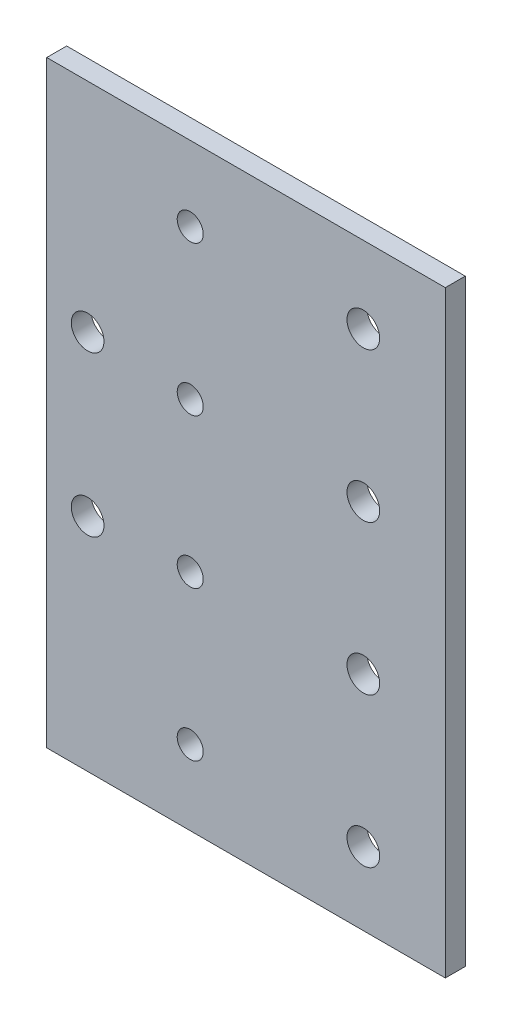
ISO-10303-21;
HEADER;
FILE_DESCRIPTION(('STEP AP214'),'2;1');
FILE_NAME('part.step','',(''),(''),'','','');
FILE_SCHEMA(('AUTOMOTIVE_DESIGN { 1 0 10303 214 1 1 1 1 }'));
ENDSEC;
DATA;
#1=APPLICATION_CONTEXT('core data for automotive mechanical design processes');
#2=APPLICATION_PROTOCOL_DEFINITION('international standard','automotive_design',2000,#1);
#3=PRODUCT_CONTEXT('',#1,'mechanical');
#4=PRODUCT('Part','Part','',(#3));
#5=PRODUCT_RELATED_PRODUCT_CATEGORY('part','',(#4));
#6=PRODUCT_DEFINITION_FORMATION('','',#4);
#7=PRODUCT_DEFINITION_CONTEXT('part definition',#1,'design');
#8=PRODUCT_DEFINITION('design','',#6,#7);
#9=PRODUCT_DEFINITION_SHAPE('','',#8);
#10=(LENGTH_UNIT() NAMED_UNIT(*) SI_UNIT(.MILLI.,.METRE.));
#11=(NAMED_UNIT(*) PLANE_ANGLE_UNIT() SI_UNIT($,.RADIAN.));
#12=(NAMED_UNIT(*) SI_UNIT($,.STERADIAN.) SOLID_ANGLE_UNIT());
#13=UNCERTAINTY_MEASURE_WITH_UNIT(LENGTH_MEASURE(1.E-05),#10,'distance_accuracy_value','');
#14=(GEOMETRIC_REPRESENTATION_CONTEXT(3) GLOBAL_UNCERTAINTY_ASSIGNED_CONTEXT((#13)) GLOBAL_UNIT_ASSIGNED_CONTEXT((#10,
#11,#12)) REPRESENTATION_CONTEXT('',''));
#15=CARTESIAN_POINT('',(0.,0.,0.));
#16=DIRECTION('',(0.,0.,1.));
#17=DIRECTION('',(1.,0.,0.));
#18=AXIS2_PLACEMENT_3D('',#15,#16,#17);
#19=CARTESIAN_POINT('',(-123.010889244468,0.505314120057289,5.));
#20=DIRECTION('',(0.,-1.,0.));
#21=DIRECTION('',(1.,0.,0.));
#22=AXIS2_PLACEMENT_3D('',#19,#20,#21);
#23=PLANE('',#22);
#24=DIRECTION('',(-1.,0.,0.));
#25=VECTOR('',#24,1.);
#26=CARTESIAN_POINT('',(-123.010889244468,0.505314120057289,0.));
#27=LINE('',#26,#25);
#28=CARTESIAN_POINT('',(-123.010889244468,0.505314120057289,0.));
#29=VERTEX_POINT('',#28);
#30=CARTESIAN_POINT('',(-223.010889244468,0.505314120057284,0.));
#31=VERTEX_POINT('',#30);
#32=EDGE_CURVE('E96',#29,#31,#27,.T.);
#33=ORIENTED_EDGE('',*,*,#32,.T.);
#34=DIRECTION('',(0.,0.,-1.));
#35=VECTOR('',#34,1.);
#36=CARTESIAN_POINT('',(-223.010889244468,0.505314120057284,5.));
#37=LINE('',#36,#35);
#38=CARTESIAN_POINT('',(-223.010889244468,0.505314120057284,5.));
#39=VERTEX_POINT('',#38);
#40=EDGE_CURVE('E11',#39,#31,#37,.T.);
#41=ORIENTED_EDGE('',*,*,#40,.F.);
#42=DIRECTION('',(-1.,0.,0.));
#43=VECTOR('',#42,1.);
#44=CARTESIAN_POINT('',(-123.010889244468,0.505314120057289,5.));
#45=LINE('',#44,#43);
#46=CARTESIAN_POINT('',(-123.010889244468,0.505314120057289,5.));
#47=VERTEX_POINT('',#46);
#48=EDGE_CURVE('E82',#47,#39,#45,.T.);
#49=ORIENTED_EDGE('',*,*,#48,.F.);
#50=DIRECTION('',(0.,0.,-1.));
#51=VECTOR('',#50,1.);
#52=CARTESIAN_POINT('',(-123.010889244468,0.505314120057289,5.));
#53=LINE('',#52,#51);
#54=EDGE_CURVE('E49',#47,#29,#53,.T.);
#55=ORIENTED_EDGE('',*,*,#54,.T.);
#56=EDGE_LOOP('',(#33,#41,#49,#55));
#57=FACE_BOUND('',#56,.T.);
#58=ADVANCED_FACE('F33',(#57),#23,.F.);
#59=CARTESIAN_POINT('',(-223.010889244468,0.505314120057284,5.));
#60=DIRECTION('',(1.,0.,0.));
#61=DIRECTION('',(0.,0.,-1.));
#62=AXIS2_PLACEMENT_3D('',#59,#60,#61);
#63=PLANE('',#62);
#64=DIRECTION('',(0.,-1.,0.));
#65=VECTOR('',#64,1.);
#66=CARTESIAN_POINT('',(-223.010889244468,0.505314120057284,0.));
#67=LINE('',#66,#65);
#68=CARTESIAN_POINT('',(-223.010889244468,-149.494685879943,0.));
#69=VERTEX_POINT('',#68);
#70=EDGE_CURVE('E87',#31,#69,#67,.T.);
#71=ORIENTED_EDGE('',*,*,#70,.T.);
#72=DIRECTION('',(0.,0.,-1.));
#73=VECTOR('',#72,1.);
#74=CARTESIAN_POINT('',(-223.010889244468,-149.494685879943,5.));
#75=LINE('',#74,#73);
#76=CARTESIAN_POINT('',(-223.010889244468,-149.494685879943,5.));
#77=VERTEX_POINT('',#76);
#78=EDGE_CURVE('E41',#77,#69,#75,.T.);
#79=ORIENTED_EDGE('',*,*,#78,.F.);
#80=DIRECTION('',(0.,-1.,0.));
#81=VECTOR('',#80,1.);
#82=CARTESIAN_POINT('',(-223.010889244468,0.505314120057284,5.));
#83=LINE('',#82,#81);
#84=EDGE_CURVE('E74',#39,#77,#83,.T.);
#85=ORIENTED_EDGE('',*,*,#84,.F.);
#86=ORIENTED_EDGE('',*,*,#40,.T.);
#87=EDGE_LOOP('',(#71,#79,#85,#86));
#88=FACE_BOUND('',#87,.T.);
#89=ADVANCED_FACE('F86',(#88),#63,.F.);
#90=CARTESIAN_POINT('',(-123.010889244468,-149.494685879943,5.));
#91=DIRECTION('',(0.,-1.,0.));
#92=DIRECTION('',(1.,0.,0.));
#93=AXIS2_PLACEMENT_3D('',#90,#91,#92);
#94=PLANE('',#93);
#95=DIRECTION('',(-1.,0.,0.));
#96=VECTOR('',#95,1.);
#97=CARTESIAN_POINT('',(-123.010889244468,-149.494685879943,0.));
#98=LINE('',#97,#96);
#99=CARTESIAN_POINT('',(-123.010889244468,-149.494685879943,0.));
#100=VERTEX_POINT('',#99);
#101=EDGE_CURVE('E100',#100,#69,#98,.T.);
#102=ORIENTED_EDGE('',*,*,#101,.F.);
#103=DIRECTION('',(0.,0.,-1.));
#104=VECTOR('',#103,1.);
#105=CARTESIAN_POINT('',(-123.010889244468,-149.494685879943,5.));
#106=LINE('',#105,#104);
#107=CARTESIAN_POINT('',(-123.010889244468,-149.494685879943,5.));
#108=VERTEX_POINT('',#107);
#109=EDGE_CURVE('E63',#108,#100,#106,.T.);
#110=ORIENTED_EDGE('',*,*,#109,.F.);
#111=DIRECTION('',(-1.,0.,0.));
#112=VECTOR('',#111,1.);
#113=CARTESIAN_POINT('',(-123.010889244468,-149.494685879943,5.));
#114=LINE('',#113,#112);
#115=EDGE_CURVE('E81',#108,#77,#114,.T.);
#116=ORIENTED_EDGE('',*,*,#115,.T.);
#117=ORIENTED_EDGE('',*,*,#78,.T.);
#118=EDGE_LOOP('',(#102,#110,#116,#117));
#119=FACE_BOUND('',#118,.T.);
#120=ADVANCED_FACE('F90',(#119),#94,.T.);
#121=CARTESIAN_POINT('',(-123.010889244468,0.505314120057289,5.));
#122=DIRECTION('',(1.,0.,0.));
#123=DIRECTION('',(0.,1.,0.));
#124=AXIS2_PLACEMENT_3D('',#121,#122,#123);
#125=PLANE('',#124);
#126=DIRECTION('',(0.,-1.,0.));
#127=VECTOR('',#126,1.);
#128=CARTESIAN_POINT('',(-123.010889244468,0.505314120057289,0.));
#129=LINE('',#128,#127);
#130=EDGE_CURVE('E102',#29,#100,#129,.T.);
#131=ORIENTED_EDGE('',*,*,#130,.F.);
#132=ORIENTED_EDGE('',*,*,#54,.F.);
#133=DIRECTION('',(0.,-1.,0.));
#134=VECTOR('',#133,1.);
#135=CARTESIAN_POINT('',(-123.010889244468,0.505314120057289,5.));
#136=LINE('',#135,#134);
#137=EDGE_CURVE('E91',#47,#108,#136,.T.);
#138=ORIENTED_EDGE('',*,*,#137,.T.);
#139=ORIENTED_EDGE('',*,*,#109,.T.);
#140=EDGE_LOOP('',(#131,#132,#138,#139));
#141=FACE_BOUND('',#140,.T.);
#142=ADVANCED_FACE('F180',(#141),#125,.T.);
#143=CARTESIAN_POINT('',(0.,0.,5.));
#144=DIRECTION('',(0.,0.,1.));
#145=DIRECTION('',(1.,0.,0.));
#146=AXIS2_PLACEMENT_3D('',#143,#144,#145);
#147=PLANE('',#146);
#148=CARTESIAN_POINT('',(-187.010889244468,-18.2446858799427,5.));
#149=DIRECTION('',(0.,0.,1.));
#150=DIRECTION('',(1.,0.,0.));
#151=AXIS2_PLACEMENT_3D('',#148,#149,#150);
#152=CIRCLE('',#151,3.26389999999998);
#153=CARTESIAN_POINT('',(-183.746989244468,-18.2446858799427,5.));
#154=VERTEX_POINT('',#153);
#155=EDGE_CURVE('E162',#154,#154,#152,.T.);
#156=ORIENTED_EDGE('',*,*,#155,.F.);
#157=EDGE_LOOP('',(#156));
#158=FACE_BOUND('',#157,.T.);
#159=CARTESIAN_POINT('',(-187.010889244468,-55.7446858799427,5.));
#160=DIRECTION('',(0.,0.,1.));
#161=DIRECTION('',(1.,0.,0.));
#162=AXIS2_PLACEMENT_3D('',#159,#160,#161);
#163=CIRCLE('',#162,3.26389999999998);
#164=CARTESIAN_POINT('',(-183.746989244468,-55.7446858799427,5.));
#165=VERTEX_POINT('',#164);
#166=EDGE_CURVE('E156',#165,#165,#163,.T.);
#167=ORIENTED_EDGE('',*,*,#166,.F.);
#168=EDGE_LOOP('',(#167));
#169=FACE_BOUND('',#168,.T.);
#170=CARTESIAN_POINT('',(-187.010889244468,-93.2446858799427,5.));
#171=DIRECTION('',(0.,0.,1.));
#172=DIRECTION('',(1.,0.,0.));
#173=AXIS2_PLACEMENT_3D('',#170,#171,#172);
#174=CIRCLE('',#173,3.26389999999998);
#175=CARTESIAN_POINT('',(-183.746989244468,-93.2446858799427,5.));
#176=VERTEX_POINT('',#175);
#177=EDGE_CURVE('E150',#176,#176,#174,.T.);
#178=ORIENTED_EDGE('',*,*,#177,.F.);
#179=EDGE_LOOP('',(#178));
#180=FACE_BOUND('',#179,.T.);
#181=CARTESIAN_POINT('',(-187.010889244468,-130.744685879943,5.));
#182=DIRECTION('',(0.,0.,1.));
#183=DIRECTION('',(1.,0.,0.));
#184=AXIS2_PLACEMENT_3D('',#181,#182,#183);
#185=CIRCLE('',#184,3.26389999999998);
#186=CARTESIAN_POINT('',(-183.746989244468,-130.744685879943,5.));
#187=VERTEX_POINT('',#186);
#188=EDGE_CURVE('E144',#187,#187,#185,.T.);
#189=ORIENTED_EDGE('',*,*,#188,.F.);
#190=EDGE_LOOP('',(#189));
#191=FACE_BOUND('',#190,.T.);
#192=CARTESIAN_POINT('',(-143.584758496396,-18.7500000000002,5.));
#193=DIRECTION('',(0.,0.,-1.));
#194=DIRECTION('',(-1.,0.,0.));
#195=AXIS2_PLACEMENT_3D('',#192,#193,#194);
#196=CIRCLE('',#195,4.10209999999999);
#197=CARTESIAN_POINT('',(-147.686858496396,-18.7500000000002,5.));
#198=VERTEX_POINT('',#197);
#199=EDGE_CURVE('E98',#198,#198,#196,.T.);
#200=ORIENTED_EDGE('',*,*,#199,.T.);
#201=EDGE_LOOP('',(#200));
#202=FACE_BOUND('',#201,.T.);
#203=CARTESIAN_POINT('',(-143.584758496396,-56.2500000000002,5.));
#204=DIRECTION('',(0.,0.,-1.));
#205=DIRECTION('',(-1.,0.,0.));
#206=AXIS2_PLACEMENT_3D('',#203,#204,#205);
#207=CIRCLE('',#206,4.10209999999999);
#208=CARTESIAN_POINT('',(-147.686858496396,-56.2500000000002,5.));
#209=VERTEX_POINT('',#208);
#210=EDGE_CURVE('E136',#209,#209,#207,.T.);
#211=ORIENTED_EDGE('',*,*,#210,.T.);
#212=EDGE_LOOP('',(#211));
#213=FACE_BOUND('',#212,.T.);
#214=CARTESIAN_POINT('',(-143.584758496396,-93.7500000000002,5.));
#215=DIRECTION('',(0.,0.,-1.));
#216=DIRECTION('',(-1.,0.,0.));
#217=AXIS2_PLACEMENT_3D('',#214,#215,#216);
#218=CIRCLE('',#217,4.10209999999999);
#219=CARTESIAN_POINT('',(-147.686858496396,-93.7500000000002,5.));
#220=VERTEX_POINT('',#219);
#221=EDGE_CURVE('E130',#220,#220,#218,.T.);
#222=ORIENTED_EDGE('',*,*,#221,.T.);
#223=EDGE_LOOP('',(#222));
#224=FACE_BOUND('',#223,.T.);
#225=CARTESIAN_POINT('',(-212.756022810851,-54.0128788453026,5.));
#226=DIRECTION('',(0.,0.,-1.));
#227=DIRECTION('',(-1.,0.,0.));
#228=AXIS2_PLACEMENT_3D('',#225,#226,#227);
#229=CIRCLE('',#228,4.10209999999999);
#230=CARTESIAN_POINT('',(-216.858122810851,-54.0128788453026,5.));
#231=VERTEX_POINT('',#230);
#232=EDGE_CURVE('E124',#231,#231,#229,.T.);
#233=ORIENTED_EDGE('',*,*,#232,.T.);
#234=EDGE_LOOP('',(#233));
#235=FACE_BOUND('',#234,.T.);
#236=CARTESIAN_POINT('',(-212.756022810851,-94.0128788453026,5.));
#237=DIRECTION('',(0.,0.,-1.));
#238=DIRECTION('',(-1.,0.,0.));
#239=AXIS2_PLACEMENT_3D('',#236,#237,#238);
#240=CIRCLE('',#239,4.10209999999999);
#241=CARTESIAN_POINT('',(-216.858122810851,-94.0128788453026,5.));
#242=VERTEX_POINT('',#241);
#243=EDGE_CURVE('E118',#242,#242,#240,.T.);
#244=ORIENTED_EDGE('',*,*,#243,.T.);
#245=EDGE_LOOP('',(#244));
#246=FACE_BOUND('',#245,.T.);
#247=CARTESIAN_POINT('',(-143.584758496396,-131.25,5.));
#248=DIRECTION('',(0.,0.,-1.));
#249=DIRECTION('',(-1.,0.,0.));
#250=AXIS2_PLACEMENT_3D('',#247,#248,#249);
#251=CIRCLE('',#250,4.10209999999999);
#252=CARTESIAN_POINT('',(-147.686858496396,-131.25,5.));
#253=VERTEX_POINT('',#252);
#254=EDGE_CURVE('E111',#253,#253,#251,.T.);
#255=ORIENTED_EDGE('',*,*,#254,.T.);
#256=EDGE_LOOP('',(#255));
#257=FACE_BOUND('',#256,.T.);
#258=ORIENTED_EDGE('',*,*,#48,.T.);
#259=ORIENTED_EDGE('',*,*,#84,.T.);
#260=ORIENTED_EDGE('',*,*,#115,.F.);
#261=ORIENTED_EDGE('',*,*,#137,.F.);
#262=EDGE_LOOP('',(#258,#259,#260,#261));
#263=FACE_BOUND('',#262,.T.);
#264=ADVANCED_FACE('F78',(#158,#169,#180,#191,#202,#213,#224,#235,#246,#257,#263),#147,.T.);
#265=CARTESIAN_POINT('',(0.,0.,0.));
#266=DIRECTION('',(0.,0.,1.));
#267=DIRECTION('',(1.,0.,0.));
#268=AXIS2_PLACEMENT_3D('',#265,#266,#267);
#269=PLANE('',#268);
#270=CARTESIAN_POINT('',(-187.010889244468,-18.2446858799427,0.));
#271=DIRECTION('',(0.,0.,1.));
#272=DIRECTION('',(1.,0.,0.));
#273=AXIS2_PLACEMENT_3D('',#270,#271,#272);
#274=CIRCLE('',#273,3.26389999999998);
#275=CARTESIAN_POINT('',(-183.746989244468,-18.2446858799427,0.));
#276=VERTEX_POINT('',#275);
#277=EDGE_CURVE('E112',#276,#276,#274,.T.);
#278=ORIENTED_EDGE('',*,*,#277,.T.);
#279=EDGE_LOOP('',(#278));
#280=FACE_BOUND('',#279,.T.);
#281=CARTESIAN_POINT('',(-187.010889244468,-55.7446858799427,0.));
#282=DIRECTION('',(0.,0.,1.));
#283=DIRECTION('',(1.,0.,0.));
#284=AXIS2_PLACEMENT_3D('',#281,#282,#283);
#285=CIRCLE('',#284,3.26389999999998);
#286=CARTESIAN_POINT('',(-183.746989244468,-55.7446858799427,0.));
#287=VERTEX_POINT('',#286);
#288=EDGE_CURVE('E159',#287,#287,#285,.T.);
#289=ORIENTED_EDGE('',*,*,#288,.T.);
#290=EDGE_LOOP('',(#289));
#291=FACE_BOUND('',#290,.T.);
#292=CARTESIAN_POINT('',(-187.010889244468,-93.2446858799427,0.));
#293=DIRECTION('',(0.,0.,1.));
#294=DIRECTION('',(1.,0.,0.));
#295=AXIS2_PLACEMENT_3D('',#292,#293,#294);
#296=CIRCLE('',#295,3.26389999999998);
#297=CARTESIAN_POINT('',(-183.746989244468,-93.2446858799427,0.));
#298=VERTEX_POINT('',#297);
#299=EDGE_CURVE('E153',#298,#298,#296,.T.);
#300=ORIENTED_EDGE('',*,*,#299,.T.);
#301=EDGE_LOOP('',(#300));
#302=FACE_BOUND('',#301,.T.);
#303=CARTESIAN_POINT('',(-187.010889244468,-130.744685879943,0.));
#304=DIRECTION('',(0.,0.,1.));
#305=DIRECTION('',(1.,0.,0.));
#306=AXIS2_PLACEMENT_3D('',#303,#304,#305);
#307=CIRCLE('',#306,3.26389999999998);
#308=CARTESIAN_POINT('',(-183.746989244468,-130.744685879943,0.));
#309=VERTEX_POINT('',#308);
#310=EDGE_CURVE('E147',#309,#309,#307,.T.);
#311=ORIENTED_EDGE('',*,*,#310,.T.);
#312=EDGE_LOOP('',(#311));
#313=FACE_BOUND('',#312,.T.);
#314=CARTESIAN_POINT('',(-143.584758496396,-18.7500000000002,0.));
#315=DIRECTION('',(0.,0.,-1.));
#316=DIRECTION('',(-1.,0.,0.));
#317=AXIS2_PLACEMENT_3D('',#314,#315,#316);
#318=CIRCLE('',#317,4.10209999999999);
#319=CARTESIAN_POINT('',(-147.686858496396,-18.7500000000002,0.));
#320=VERTEX_POINT('',#319);
#321=EDGE_CURVE('E139',#320,#320,#318,.T.);
#322=ORIENTED_EDGE('',*,*,#321,.F.);
#323=EDGE_LOOP('',(#322));
#324=FACE_BOUND('',#323,.T.);
#325=CARTESIAN_POINT('',(-143.584758496396,-56.2500000000002,0.));
#326=DIRECTION('',(0.,0.,-1.));
#327=DIRECTION('',(-1.,0.,0.));
#328=AXIS2_PLACEMENT_3D('',#325,#326,#327);
#329=CIRCLE('',#328,4.10209999999999);
#330=CARTESIAN_POINT('',(-147.686858496396,-56.2500000000002,0.));
#331=VERTEX_POINT('',#330);
#332=EDGE_CURVE('E133',#331,#331,#329,.T.);
#333=ORIENTED_EDGE('',*,*,#332,.F.);
#334=EDGE_LOOP('',(#333));
#335=FACE_BOUND('',#334,.T.);
#336=CARTESIAN_POINT('',(-143.584758496396,-93.7500000000002,0.));
#337=DIRECTION('',(0.,0.,-1.));
#338=DIRECTION('',(-1.,0.,0.));
#339=AXIS2_PLACEMENT_3D('',#336,#337,#338);
#340=CIRCLE('',#339,4.10209999999999);
#341=CARTESIAN_POINT('',(-147.686858496396,-93.7500000000002,0.));
#342=VERTEX_POINT('',#341);
#343=EDGE_CURVE('E127',#342,#342,#340,.T.);
#344=ORIENTED_EDGE('',*,*,#343,.F.);
#345=EDGE_LOOP('',(#344));
#346=FACE_BOUND('',#345,.T.);
#347=CARTESIAN_POINT('',(-212.756022810851,-54.0128788453026,0.));
#348=DIRECTION('',(0.,0.,-1.));
#349=DIRECTION('',(-1.,0.,0.));
#350=AXIS2_PLACEMENT_3D('',#347,#348,#349);
#351=CIRCLE('',#350,4.10209999999999);
#352=CARTESIAN_POINT('',(-216.858122810851,-54.0128788453026,0.));
#353=VERTEX_POINT('',#352);
#354=EDGE_CURVE('E121',#353,#353,#351,.T.);
#355=ORIENTED_EDGE('',*,*,#354,.F.);
#356=EDGE_LOOP('',(#355));
#357=FACE_BOUND('',#356,.T.);
#358=CARTESIAN_POINT('',(-212.756022810851,-94.0128788453026,0.));
#359=DIRECTION('',(0.,0.,-1.));
#360=DIRECTION('',(-1.,0.,0.));
#361=AXIS2_PLACEMENT_3D('',#358,#359,#360);
#362=CIRCLE('',#361,4.10209999999999);
#363=CARTESIAN_POINT('',(-216.858122810851,-94.0128788453026,0.));
#364=VERTEX_POINT('',#363);
#365=EDGE_CURVE('E115',#364,#364,#362,.T.);
#366=ORIENTED_EDGE('',*,*,#365,.F.);
#367=EDGE_LOOP('',(#366));
#368=FACE_BOUND('',#367,.T.);
#369=CARTESIAN_POINT('',(-143.584758496396,-131.25,0.));
#370=DIRECTION('',(0.,0.,-1.));
#371=DIRECTION('',(-1.,0.,0.));
#372=AXIS2_PLACEMENT_3D('',#369,#370,#371);
#373=CIRCLE('',#372,4.10209999999999);
#374=CARTESIAN_POINT('',(-147.686858496396,-131.25,0.));
#375=VERTEX_POINT('',#374);
#376=EDGE_CURVE('E108',#375,#375,#373,.T.);
#377=ORIENTED_EDGE('',*,*,#376,.F.);
#378=EDGE_LOOP('',(#377));
#379=FACE_BOUND('',#378,.T.);
#380=ORIENTED_EDGE('',*,*,#32,.F.);
#381=ORIENTED_EDGE('',*,*,#130,.T.);
#382=ORIENTED_EDGE('',*,*,#101,.T.);
#383=ORIENTED_EDGE('',*,*,#70,.F.);
#384=EDGE_LOOP('',(#380,#381,#382,#383));
#385=FACE_BOUND('',#384,.T.);
#386=ADVANCED_FACE('F168',(#280,#291,#302,#313,#324,#335,#346,#357,#368,#379,#385),#269,.F.);
#387=CARTESIAN_POINT('',(-143.584758496396,-131.25,5.));
#388=DIRECTION('',(0.,0.,-1.));
#389=DIRECTION('',(-1.,0.,0.));
#390=AXIS2_PLACEMENT_3D('',#387,#388,#389);
#391=CYLINDRICAL_SURFACE('',#390,4.10209999999999);
#392=ORIENTED_EDGE('',*,*,#254,.F.);
#393=EDGE_LOOP('',(#392));
#394=FACE_BOUND('',#393,.T.);
#395=ORIENTED_EDGE('',*,*,#376,.T.);
#396=EDGE_LOOP('',(#395));
#397=FACE_BOUND('',#396,.T.);
#398=ADVANCED_FACE('F200',(#394,#397),#391,.F.);
#399=CARTESIAN_POINT('',(-212.756022810851,-94.0128788453026,5.));
#400=DIRECTION('',(0.,0.,-1.));
#401=DIRECTION('',(-1.,0.,0.));
#402=AXIS2_PLACEMENT_3D('',#399,#400,#401);
#403=CYLINDRICAL_SURFACE('',#402,4.10209999999999);
#404=ORIENTED_EDGE('',*,*,#243,.F.);
#405=EDGE_LOOP('',(#404));
#406=FACE_BOUND('',#405,.T.);
#407=ORIENTED_EDGE('',*,*,#365,.T.);
#408=EDGE_LOOP('',(#407));
#409=FACE_BOUND('',#408,.T.);
#410=ADVANCED_FACE('F203',(#406,#409),#403,.F.);
#411=CARTESIAN_POINT('',(-212.756022810851,-54.0128788453026,5.));
#412=DIRECTION('',(0.,0.,-1.));
#413=DIRECTION('',(-1.,0.,0.));
#414=AXIS2_PLACEMENT_3D('',#411,#412,#413);
#415=CYLINDRICAL_SURFACE('',#414,4.10209999999999);
#416=ORIENTED_EDGE('',*,*,#232,.F.);
#417=EDGE_LOOP('',(#416));
#418=FACE_BOUND('',#417,.T.);
#419=ORIENTED_EDGE('',*,*,#354,.T.);
#420=EDGE_LOOP('',(#419));
#421=FACE_BOUND('',#420,.T.);
#422=ADVANCED_FACE('F246',(#418,#421),#415,.F.);
#423=CARTESIAN_POINT('',(-143.584758496396,-93.7500000000002,5.));
#424=DIRECTION('',(0.,0.,-1.));
#425=DIRECTION('',(-1.,0.,0.));
#426=AXIS2_PLACEMENT_3D('',#423,#424,#425);
#427=CYLINDRICAL_SURFACE('',#426,4.10209999999999);
#428=ORIENTED_EDGE('',*,*,#221,.F.);
#429=EDGE_LOOP('',(#428));
#430=FACE_BOUND('',#429,.T.);
#431=ORIENTED_EDGE('',*,*,#343,.T.);
#432=EDGE_LOOP('',(#431));
#433=FACE_BOUND('',#432,.T.);
#434=ADVANCED_FACE('F256',(#430,#433),#427,.F.);
#435=CARTESIAN_POINT('',(-143.584758496396,-56.2500000000002,5.));
#436=DIRECTION('',(0.,0.,-1.));
#437=DIRECTION('',(-1.,0.,0.));
#438=AXIS2_PLACEMENT_3D('',#435,#436,#437);
#439=CYLINDRICAL_SURFACE('',#438,4.10209999999999);
#440=ORIENTED_EDGE('',*,*,#210,.F.);
#441=EDGE_LOOP('',(#440));
#442=FACE_BOUND('',#441,.T.);
#443=ORIENTED_EDGE('',*,*,#332,.T.);
#444=EDGE_LOOP('',(#443));
#445=FACE_BOUND('',#444,.T.);
#446=ADVANCED_FACE('F266',(#442,#445),#439,.F.);
#447=CARTESIAN_POINT('',(-143.584758496396,-18.7500000000002,5.));
#448=DIRECTION('',(0.,0.,-1.));
#449=DIRECTION('',(-1.,0.,0.));
#450=AXIS2_PLACEMENT_3D('',#447,#448,#449);
#451=CYLINDRICAL_SURFACE('',#450,4.10209999999999);
#452=ORIENTED_EDGE('',*,*,#199,.F.);
#453=EDGE_LOOP('',(#452));
#454=FACE_BOUND('',#453,.T.);
#455=ORIENTED_EDGE('',*,*,#321,.T.);
#456=EDGE_LOOP('',(#455));
#457=FACE_BOUND('',#456,.T.);
#458=ADVANCED_FACE('F276',(#454,#457),#451,.F.);
#459=CARTESIAN_POINT('',(-187.010889244468,-130.744685879943,0.));
#460=DIRECTION('',(0.,0.,1.));
#461=DIRECTION('',(1.,0.,0.));
#462=AXIS2_PLACEMENT_3D('',#459,#460,#461);
#463=CYLINDRICAL_SURFACE('',#462,3.26389999999998);
#464=ORIENTED_EDGE('',*,*,#310,.F.);
#465=EDGE_LOOP('',(#464));
#466=FACE_BOUND('',#465,.T.);
#467=ORIENTED_EDGE('',*,*,#188,.T.);
#468=EDGE_LOOP('',(#467));
#469=FACE_BOUND('',#468,.T.);
#470=ADVANCED_FACE('F286',(#466,#469),#463,.F.);
#471=CARTESIAN_POINT('',(-187.010889244468,-93.2446858799427,0.));
#472=DIRECTION('',(0.,0.,1.));
#473=DIRECTION('',(1.,0.,0.));
#474=AXIS2_PLACEMENT_3D('',#471,#472,#473);
#475=CYLINDRICAL_SURFACE('',#474,3.26389999999998);
#476=ORIENTED_EDGE('',*,*,#299,.F.);
#477=EDGE_LOOP('',(#476));
#478=FACE_BOUND('',#477,.T.);
#479=ORIENTED_EDGE('',*,*,#177,.T.);
#480=EDGE_LOOP('',(#479));
#481=FACE_BOUND('',#480,.T.);
#482=ADVANCED_FACE('F306',(#478,#481),#475,.F.);
#483=CARTESIAN_POINT('',(-187.010889244468,-55.7446858799427,0.));
#484=DIRECTION('',(0.,0.,1.));
#485=DIRECTION('',(1.,0.,0.));
#486=AXIS2_PLACEMENT_3D('',#483,#484,#485);
#487=CYLINDRICAL_SURFACE('',#486,3.26389999999998);
#488=ORIENTED_EDGE('',*,*,#288,.F.);
#489=EDGE_LOOP('',(#488));
#490=FACE_BOUND('',#489,.T.);
#491=ORIENTED_EDGE('',*,*,#166,.T.);
#492=EDGE_LOOP('',(#491));
#493=FACE_BOUND('',#492,.T.);
#494=ADVANCED_FACE('F174',(#490,#493),#487,.F.);
#495=CARTESIAN_POINT('',(-187.010889244468,-18.2446858799427,0.));
#496=DIRECTION('',(0.,0.,1.));
#497=DIRECTION('',(1.,0.,0.));
#498=AXIS2_PLACEMENT_3D('',#495,#496,#497);
#499=CYLINDRICAL_SURFACE('',#498,3.26389999999998);
#500=ORIENTED_EDGE('',*,*,#277,.F.);
#501=EDGE_LOOP('',(#500));
#502=FACE_BOUND('',#501,.T.);
#503=ORIENTED_EDGE('',*,*,#155,.T.);
#504=EDGE_LOOP('',(#503));
#505=FACE_BOUND('',#504,.T.);
#506=ADVANCED_FACE('F171',(#502,#505),#499,.F.);
#507=CLOSED_SHELL('',(#58,#89,#120,#142,#264,#386,#398,#410,#422,#434,#446,#458,#470,#482,#494,#506));
#508=MANIFOLD_SOLID_BREP('B2',#507);
#509=ADVANCED_BREP_SHAPE_REPRESENTATION('',(#18,#508),#14);
#510=SHAPE_DEFINITION_REPRESENTATION(#9,#509);
ENDSEC;
END-ISO-10303-21;
